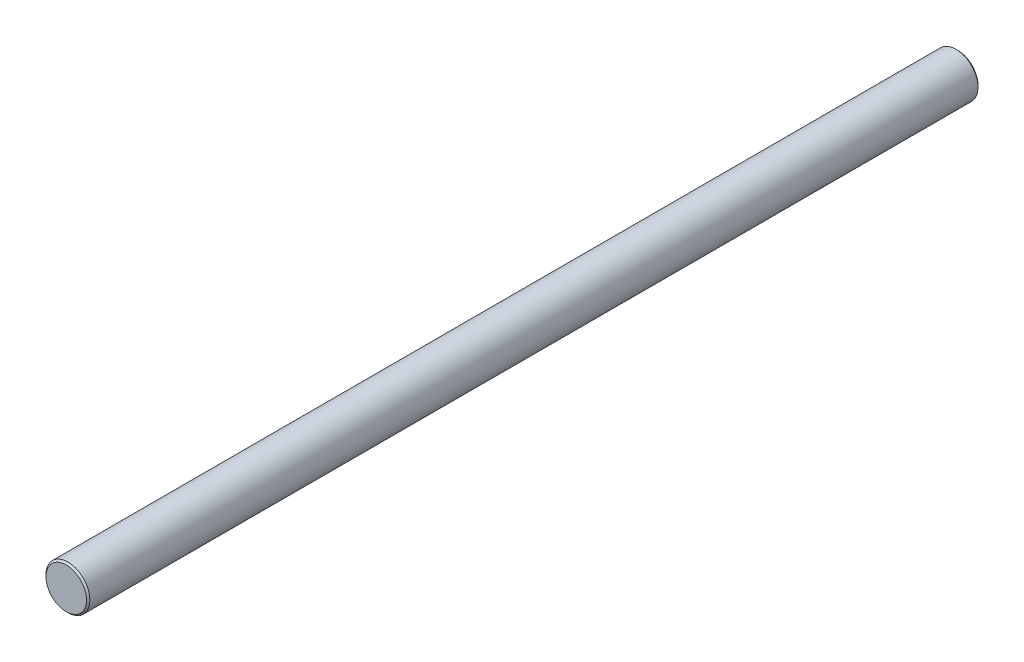
ISO-10303-21;
HEADER;
FILE_DESCRIPTION(('STEP AP214'),'2;1');
FILE_NAME('part.step','',(''),(''),'','','');
FILE_SCHEMA(('AUTOMOTIVE_DESIGN { 1 0 10303 214 1 1 1 1 }'));
ENDSEC;
DATA;
#1=APPLICATION_CONTEXT('core data for automotive mechanical design processes');
#2=APPLICATION_PROTOCOL_DEFINITION('international standard','automotive_design',2000,#1);
#3=PRODUCT_CONTEXT('',#1,'mechanical');
#4=PRODUCT('Part','Part','',(#3));
#5=PRODUCT_RELATED_PRODUCT_CATEGORY('part','',(#4));
#6=PRODUCT_DEFINITION_FORMATION('','',#4);
#7=PRODUCT_DEFINITION_CONTEXT('part definition',#1,'design');
#8=PRODUCT_DEFINITION('design','',#6,#7);
#9=PRODUCT_DEFINITION_SHAPE('','',#8);
#10=(LENGTH_UNIT() NAMED_UNIT(*) SI_UNIT(.MILLI.,.METRE.));
#11=(NAMED_UNIT(*) PLANE_ANGLE_UNIT() SI_UNIT($,.RADIAN.));
#12=(NAMED_UNIT(*) SI_UNIT($,.STERADIAN.) SOLID_ANGLE_UNIT());
#13=UNCERTAINTY_MEASURE_WITH_UNIT(LENGTH_MEASURE(1.E-05),#10,'distance_accuracy_value','');
#14=(GEOMETRIC_REPRESENTATION_CONTEXT(3) GLOBAL_UNCERTAINTY_ASSIGNED_CONTEXT((#13)) GLOBAL_UNIT_ASSIGNED_CONTEXT((#10,
#11,#12)) REPRESENTATION_CONTEXT('',''));
#15=CARTESIAN_POINT('',(0.,0.,0.));
#16=DIRECTION('',(0.,0.,1.));
#17=DIRECTION('',(1.,0.,0.));
#18=AXIS2_PLACEMENT_3D('',#15,#16,#17);
#19=CARTESIAN_POINT('',(0.,0.,203.2));
#20=DIRECTION('',(0.,0.,-1.));
#21=DIRECTION('',(-1.,0.,0.));
#22=AXIS2_PLACEMENT_3D('',#19,#20,#21);
#23=CYLINDRICAL_SURFACE('',#22,10.);
#24=CARTESIAN_POINT('',(0.,0.,-202.438));
#25=DIRECTION('',(0.,0.,1.));
#26=DIRECTION('',(1.,0.,0.));
#27=AXIS2_PLACEMENT_3D('',#24,#25,#26);
#28=CIRCLE('',#27,10.);
#29=CARTESIAN_POINT('',(10.,0.,-202.438));
#30=VERTEX_POINT('',#29);
#31=EDGE_CURVE('E41',#30,#30,#28,.T.);
#32=ORIENTED_EDGE('',*,*,#31,.T.);
#33=EDGE_LOOP('',(#32));
#34=FACE_BOUND('',#33,.T.);
#35=CARTESIAN_POINT('',(0.,0.,202.438));
#36=DIRECTION('',(0.,0.,1.));
#37=DIRECTION('',(1.,0.,0.));
#38=AXIS2_PLACEMENT_3D('',#35,#36,#37);
#39=CIRCLE('',#38,10.);
#40=CARTESIAN_POINT('',(10.,0.,202.438));
#41=VERTEX_POINT('',#40);
#42=EDGE_CURVE('E45',#41,#41,#39,.F.);
#43=ORIENTED_EDGE('',*,*,#42,.T.);
#44=EDGE_LOOP('',(#43));
#45=FACE_BOUND('',#44,.T.);
#46=ADVANCED_FACE('F30',(#34,#45),#23,.T.);
#47=CARTESIAN_POINT('',(0.,0.,203.2));
#48=DIRECTION('',(0.,0.,1.));
#49=DIRECTION('',(1.,0.,0.));
#50=AXIS2_PLACEMENT_3D('',#47,#48,#49);
#51=PLANE('',#50);
#52=CARTESIAN_POINT('',(0.,0.,203.2));
#53=DIRECTION('',(0.,0.,1.));
#54=DIRECTION('',(1.,0.,0.));
#55=AXIS2_PLACEMENT_3D('',#52,#53,#54);
#56=CIRCLE('',#55,9.23799999999997);
#57=CARTESIAN_POINT('',(9.23799999999997,0.,203.2));
#58=VERTEX_POINT('',#57);
#59=EDGE_CURVE('E10',#58,#58,#56,.T.);
#60=ORIENTED_EDGE('',*,*,#59,.T.);
#61=EDGE_LOOP('',(#60));
#62=FACE_BOUND('',#61,.T.);
#63=ADVANCED_FACE('F61',(#62),#51,.T.);
#64=CARTESIAN_POINT('',(0.,0.,-203.2));
#65=DIRECTION('',(0.,0.,1.));
#66=DIRECTION('',(1.,0.,0.));
#67=AXIS2_PLACEMENT_3D('',#64,#65,#66);
#68=PLANE('',#67);
#69=CARTESIAN_POINT('',(0.,0.,-203.2));
#70=DIRECTION('',(0.,0.,1.));
#71=DIRECTION('',(1.,0.,0.));
#72=AXIS2_PLACEMENT_3D('',#69,#70,#71);
#73=CIRCLE('',#72,9.23800000000002);
#74=CARTESIAN_POINT('',(9.23800000000002,0.,-203.2));
#75=VERTEX_POINT('',#74);
#76=EDGE_CURVE('E37',#75,#75,#73,.F.);
#77=ORIENTED_EDGE('',*,*,#76,.T.);
#78=EDGE_LOOP('',(#77));
#79=FACE_BOUND('',#78,.T.);
#80=ADVANCED_FACE('F58',(#79),#68,.F.);
#81=CARTESIAN_POINT('',(0.,0.,-202.438));
#82=DIRECTION('',(0.,0.,1.));
#83=DIRECTION('',(1.,0.,0.));
#84=AXIS2_PLACEMENT_3D('',#81,#82,#83);
#85=CONICAL_SURFACE('',#84,10.,0.785398163397406);
#86=ORIENTED_EDGE('',*,*,#76,.F.);
#87=EDGE_LOOP('',(#86));
#88=FACE_BOUND('',#87,.T.);
#89=ORIENTED_EDGE('',*,*,#31,.F.);
#90=EDGE_LOOP('',(#89));
#91=FACE_BOUND('',#90,.T.);
#92=ADVANCED_FACE('F54',(#88,#91),#85,.T.);
#93=CARTESIAN_POINT('',(0.,0.,203.2));
#94=DIRECTION('',(0.,0.,-1.));
#95=DIRECTION('',(-1.,0.,0.));
#96=AXIS2_PLACEMENT_3D('',#93,#94,#95);
#97=CONICAL_SURFACE('',#96,9.23799999999997,0.785398163397443);
#98=ORIENTED_EDGE('',*,*,#42,.F.);
#99=EDGE_LOOP('',(#98));
#100=FACE_BOUND('',#99,.T.);
#101=ORIENTED_EDGE('',*,*,#59,.F.);
#102=EDGE_LOOP('',(#101));
#103=FACE_BOUND('',#102,.T.);
#104=ADVANCED_FACE('F32',(#100,#103),#97,.T.);
#105=CLOSED_SHELL('',(#46,#63,#80,#92,#104));
#106=MANIFOLD_SOLID_BREP('B2',#105);
#107=ADVANCED_BREP_SHAPE_REPRESENTATION('',(#18,#106),#14);
#108=SHAPE_DEFINITION_REPRESENTATION(#9,#107);
ENDSEC;
END-ISO-10303-21;
